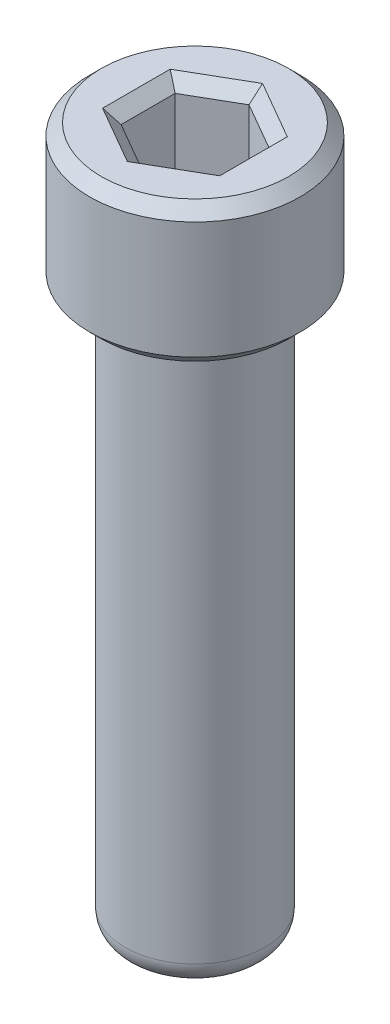
ISO-10303-21;
HEADER;
FILE_DESCRIPTION(('STEP AP214'),'2;1');
FILE_NAME('part.step','',(''),(''),'','','');
FILE_SCHEMA(('AUTOMOTIVE_DESIGN { 1 0 10303 214 1 1 1 1 }'));
ENDSEC;
DATA;
#1=APPLICATION_CONTEXT('core data for automotive mechanical design processes');
#2=APPLICATION_PROTOCOL_DEFINITION('international standard','automotive_design',2000,#1);
#3=PRODUCT_CONTEXT('',#1,'mechanical');
#4=PRODUCT('Part','Part','',(#3));
#5=PRODUCT_RELATED_PRODUCT_CATEGORY('part','',(#4));
#6=PRODUCT_DEFINITION_FORMATION('','',#4);
#7=PRODUCT_DEFINITION_CONTEXT('part definition',#1,'design');
#8=PRODUCT_DEFINITION('design','',#6,#7);
#9=PRODUCT_DEFINITION_SHAPE('','',#8);
#10=(LENGTH_UNIT() NAMED_UNIT(*) SI_UNIT(.MILLI.,.METRE.));
#11=(NAMED_UNIT(*) PLANE_ANGLE_UNIT() SI_UNIT($,.RADIAN.));
#12=(NAMED_UNIT(*) SI_UNIT($,.STERADIAN.) SOLID_ANGLE_UNIT());
#13=UNCERTAINTY_MEASURE_WITH_UNIT(LENGTH_MEASURE(1.E-05),#10,'distance_accuracy_value','');
#14=(GEOMETRIC_REPRESENTATION_CONTEXT(3) GLOBAL_UNCERTAINTY_ASSIGNED_CONTEXT((#13)) GLOBAL_UNIT_ASSIGNED_CONTEXT((#10,
#11,#12)) REPRESENTATION_CONTEXT('',''));
#15=CARTESIAN_POINT('',(0.,0.,0.));
#16=DIRECTION('',(0.,0.,1.));
#17=DIRECTION('',(1.,0.,0.));
#18=AXIS2_PLACEMENT_3D('',#15,#16,#17);
#19=CARTESIAN_POINT('',(0.,12.,0.));
#20=DIRECTION('',(0.,-1.,0.));
#21=DIRECTION('',(0.,0.,-1.));
#22=AXIS2_PLACEMENT_3D('',#19,#20,#21);
#23=CYLINDRICAL_SURFACE('',#22,1.5);
#24=CARTESIAN_POINT('',(0.,0.5,0.));
#25=DIRECTION('',(0.,1.,0.));
#26=DIRECTION('',(0.,0.,1.));
#27=AXIS2_PLACEMENT_3D('',#24,#25,#26);
#28=CIRCLE('',#27,1.5);
#29=CARTESIAN_POINT('',(0.,0.5,1.5));
#30=VERTEX_POINT('',#29);
#31=EDGE_CURVE('E58',#30,#30,#28,.T.);
#32=ORIENTED_EDGE('',*,*,#31,.T.);
#33=EDGE_LOOP('',(#32));
#34=FACE_BOUND('',#33,.T.);
#35=CARTESIAN_POINT('',(0.,12.,0.));
#36=DIRECTION('',(0.,1.,0.));
#37=DIRECTION('',(0.,0.,1.));
#38=AXIS2_PLACEMENT_3D('',#35,#36,#37);
#39=CIRCLE('',#38,1.5);
#40=CARTESIAN_POINT('',(0.,12.,1.5));
#41=VERTEX_POINT('',#40);
#42=EDGE_CURVE('E171',#41,#41,#39,.T.);
#43=ORIENTED_EDGE('',*,*,#42,.F.);
#44=EDGE_LOOP('',(#43));
#45=FACE_BOUND('',#44,.T.);
#46=ADVANCED_FACE('F49',(#34,#45),#23,.T.);
#47=CARTESIAN_POINT('',(0.,0.,0.));
#48=DIRECTION('',(0.,1.,0.));
#49=DIRECTION('',(0.,0.,1.));
#50=AXIS2_PLACEMENT_3D('',#47,#48,#49);
#51=PLANE('',#50);
#52=CARTESIAN_POINT('',(0.,0.,0.));
#53=DIRECTION('',(0.,1.,0.));
#54=DIRECTION('',(0.,0.,1.));
#55=AXIS2_PLACEMENT_3D('',#52,#53,#54);
#56=CIRCLE('',#55,1.);
#57=CARTESIAN_POINT('',(0.,0.,1.));
#58=VERTEX_POINT('',#57);
#59=EDGE_CURVE('E11',#58,#58,#56,.F.);
#60=ORIENTED_EDGE('',*,*,#59,.T.);
#61=EDGE_LOOP('',(#60));
#62=FACE_BOUND('',#61,.T.);
#63=ADVANCED_FACE('F272',(#62),#51,.F.);
#64=CARTESIAN_POINT('',(0.,15.,0.));
#65=DIRECTION('',(0.,-1.,0.));
#66=DIRECTION('',(0.,0.,-1.));
#67=AXIS2_PLACEMENT_3D('',#64,#65,#66);
#68=CYLINDRICAL_SURFACE('',#67,2.25);
#69=CARTESIAN_POINT('',(0.,12.25,0.));
#70=DIRECTION('',(0.,1.,0.));
#71=DIRECTION('',(0.,0.,1.));
#72=AXIS2_PLACEMENT_3D('',#69,#70,#71);
#73=CIRCLE('',#72,2.25);
#74=CARTESIAN_POINT('',(0.,12.25,2.25));
#75=VERTEX_POINT('',#74);
#76=EDGE_CURVE('E191',#75,#75,#73,.T.);
#77=ORIENTED_EDGE('',*,*,#76,.T.);
#78=EDGE_LOOP('',(#77));
#79=FACE_BOUND('',#78,.T.);
#80=CARTESIAN_POINT('',(0.,14.75,0.));
#81=DIRECTION('',(0.,1.,0.));
#82=DIRECTION('',(0.,0.,1.));
#83=AXIS2_PLACEMENT_3D('',#80,#81,#82);
#84=CIRCLE('',#83,2.25);
#85=CARTESIAN_POINT('',(0.,14.75,2.25));
#86=VERTEX_POINT('',#85);
#87=EDGE_CURVE('E187',#86,#86,#84,.F.);
#88=ORIENTED_EDGE('',*,*,#87,.T.);
#89=EDGE_LOOP('',(#88));
#90=FACE_BOUND('',#89,.T.);
#91=ADVANCED_FACE('F276',(#79,#90),#68,.T.);
#92=CARTESIAN_POINT('',(0.,15.,0.));
#93=DIRECTION('',(0.,1.,0.));
#94=DIRECTION('',(0.,0.,1.));
#95=AXIS2_PLACEMENT_3D('',#92,#93,#94);
#96=PLANE('',#95);
#97=CARTESIAN_POINT('',(0.,15.,0.));
#98=DIRECTION('',(0.,1.,0.));
#99=DIRECTION('',(0.,0.,1.));
#100=AXIS2_PLACEMENT_3D('',#97,#98,#99);
#101=CIRCLE('',#100,2.);
#102=CARTESIAN_POINT('',(0.,15.,2.));
#103=VERTEX_POINT('',#102);
#104=EDGE_CURVE('E218',#103,#103,#101,.T.);
#105=ORIENTED_EDGE('',*,*,#104,.T.);
#106=EDGE_LOOP('',(#105));
#107=FACE_BOUND('',#106,.T.);
#108=DIRECTION('',(-0.866025403784439,0.,0.5));
#109=VECTOR('',#108,1.);
#110=CARTESIAN_POINT('',(0.124999999999998,15.,1.37120688932536));
#111=LINE('',#110,#109);
#112=CARTESIAN_POINT('',(1.25,15.,0.721687836487031));
#113=VERTEX_POINT('',#112);
#114=CARTESIAN_POINT('',(0.,15.,1.44337567297406));
#115=VERTEX_POINT('',#114);
#116=EDGE_CURVE('E199',#113,#115,#111,.T.);
#117=ORIENTED_EDGE('',*,*,#116,.T.);
#118=DIRECTION('',(-0.866025403784439,0.,-0.5));
#119=VECTOR('',#118,1.);
#120=CARTESIAN_POINT('',(-1.125,15.,0.793856620135733));
#121=LINE('',#120,#119);
#122=CARTESIAN_POINT('',(-1.25,15.,0.72168783648703));
#123=VERTEX_POINT('',#122);
#124=EDGE_CURVE('E214',#115,#123,#121,.T.);
#125=ORIENTED_EDGE('',*,*,#124,.T.);
#126=DIRECTION('',(0.,0.,-1.));
#127=VECTOR('',#126,1.);
#128=CARTESIAN_POINT('',(-1.25,15.,-0.577350269189626));
#129=LINE('',#128,#127);
#130=CARTESIAN_POINT('',(-1.25,15.,-0.721687836487031));
#131=VERTEX_POINT('',#130);
#132=EDGE_CURVE('E211',#123,#131,#129,.T.);
#133=ORIENTED_EDGE('',*,*,#132,.T.);
#134=DIRECTION('',(0.866025403784439,0.,-0.5));
#135=VECTOR('',#134,1.);
#136=CARTESIAN_POINT('',(-0.124999999999999,15.,-1.37120688932536));
#137=LINE('',#136,#135);
#138=CARTESIAN_POINT('',(0.,15.,-1.44337567297406));
#139=VERTEX_POINT('',#138);
#140=EDGE_CURVE('E208',#131,#139,#137,.T.);
#141=ORIENTED_EDGE('',*,*,#140,.T.);
#142=DIRECTION('',(0.866025403784439,0.,0.5));
#143=VECTOR('',#142,1.);
#144=CARTESIAN_POINT('',(1.125,15.,-0.793856620135734));
#145=LINE('',#144,#143);
#146=CARTESIAN_POINT('',(1.25,15.,-0.721687836487032));
#147=VERTEX_POINT('',#146);
#148=EDGE_CURVE('E205',#139,#147,#145,.T.);
#149=ORIENTED_EDGE('',*,*,#148,.T.);
#150=DIRECTION('',(0.,0.,1.));
#151=VECTOR('',#150,1.);
#152=CARTESIAN_POINT('',(1.25,15.,0.577350269189625));
#153=LINE('',#152,#151);
#154=EDGE_CURVE('E202',#147,#113,#153,.T.);
#155=ORIENTED_EDGE('',*,*,#154,.T.);
#156=EDGE_LOOP('',(#117,#125,#133,#141,#149,#155));
#157=FACE_BOUND('',#156,.T.);
#158=ADVANCED_FACE('F338',(#107,#157),#96,.T.);
#159=CARTESIAN_POINT('',(0.,12.,0.));
#160=DIRECTION('',(0.,1.,0.));
#161=DIRECTION('',(0.,0.,1.));
#162=AXIS2_PLACEMENT_3D('',#159,#160,#161);
#163=PLANE('',#162);
#164=CARTESIAN_POINT('',(0.,12.,0.));
#165=DIRECTION('',(0.,1.,0.));
#166=DIRECTION('',(0.,0.,1.));
#167=AXIS2_PLACEMENT_3D('',#164,#165,#166);
#168=CIRCLE('',#167,1.99999999999999);
#169=CARTESIAN_POINT('',(0.,12.,1.99999999999999));
#170=VERTEX_POINT('',#169);
#171=EDGE_CURVE('E195',#170,#170,#168,.F.);
#172=ORIENTED_EDGE('',*,*,#171,.T.);
#173=EDGE_LOOP('',(#172));
#174=FACE_BOUND('',#173,.T.);
#175=ORIENTED_EDGE('',*,*,#42,.T.);
#176=EDGE_LOOP('',(#175));
#177=FACE_BOUND('',#176,.T.);
#178=ADVANCED_FACE('F372',(#174,#177),#163,.F.);
#179=CARTESIAN_POINT('',(1.,13.,-0.577350269189627));
#180=DIRECTION('',(0.5,0.,-0.866025403784439));
#181=DIRECTION('',(-0.866025403784439,0.,-0.5));
#182=AXIS2_PLACEMENT_3D('',#179,#180,#181);
#183=PLANE('',#182);
#184=DIRECTION('',(0.,1.,0.));
#185=VECTOR('',#184,1.);
#186=CARTESIAN_POINT('',(1.,13.,-0.577350269189627));
#187=LINE('',#186,#185);
#188=CARTESIAN_POINT('',(1.,13.,-0.577350269189627));
#189=VERTEX_POINT('',#188);
#190=CARTESIAN_POINT('',(1.,14.75,-0.577350269189627));
#191=VERTEX_POINT('',#190);
#192=EDGE_CURVE('E168',#189,#191,#187,.T.);
#193=ORIENTED_EDGE('',*,*,#192,.T.);
#194=DIRECTION('',(-0.866025403784439,0.,-0.5));
#195=VECTOR('',#194,1.);
#196=CARTESIAN_POINT('',(0.,14.75,-1.15470053837925));
#197=LINE('',#196,#195);
#198=CARTESIAN_POINT('',(0.,14.75,-1.15470053837925));
#199=VERTEX_POINT('',#198);
#200=EDGE_CURVE('E129',#191,#199,#197,.T.);
#201=ORIENTED_EDGE('',*,*,#200,.T.);
#202=DIRECTION('',(0.,1.,0.));
#203=VECTOR('',#202,1.);
#204=CARTESIAN_POINT('',(0.,13.,-1.15470053837925));
#205=LINE('',#204,#203);
#206=CARTESIAN_POINT('',(0.,13.,-1.15470053837925));
#207=VERTEX_POINT('',#206);
#208=EDGE_CURVE('E122',#207,#199,#205,.T.);
#209=ORIENTED_EDGE('',*,*,#208,.F.);
#210=DIRECTION('',(-0.866025403784439,0.,-0.5));
#211=VECTOR('',#210,1.);
#212=CARTESIAN_POINT('',(1.,13.,-0.577350269189627));
#213=LINE('',#212,#211);
#214=EDGE_CURVE('E126',#189,#207,#213,.T.);
#215=ORIENTED_EDGE('',*,*,#214,.F.);
#216=EDGE_LOOP('',(#193,#201,#209,#215));
#217=FACE_BOUND('',#216,.T.);
#218=ADVANCED_FACE('F124',(#217),#183,.F.);
#219=CARTESIAN_POINT('',(1.,13.,0.577350269189625));
#220=DIRECTION('',(1.,0.,0.));
#221=DIRECTION('',(0.,0.,-1.));
#222=AXIS2_PLACEMENT_3D('',#219,#220,#221);
#223=PLANE('',#222);
#224=DIRECTION('',(0.,1.,0.));
#225=VECTOR('',#224,1.);
#226=CARTESIAN_POINT('',(1.,13.,0.577350269189625));
#227=LINE('',#226,#225);
#228=CARTESIAN_POINT('',(1.,13.,0.577350269189625));
#229=VERTEX_POINT('',#228);
#230=CARTESIAN_POINT('',(1.,14.75,0.577350269189625));
#231=VERTEX_POINT('',#230);
#232=EDGE_CURVE('E172',#229,#231,#227,.T.);
#233=ORIENTED_EDGE('',*,*,#232,.T.);
#234=DIRECTION('',(0.,0.,-1.));
#235=VECTOR('',#234,1.);
#236=CARTESIAN_POINT('',(1.,14.75,-0.577350269189627));
#237=LINE('',#236,#235);
#238=EDGE_CURVE('E72',#231,#191,#237,.T.);
#239=ORIENTED_EDGE('',*,*,#238,.T.);
#240=ORIENTED_EDGE('',*,*,#192,.F.);
#241=DIRECTION('',(0.,0.,-1.));
#242=VECTOR('',#241,1.);
#243=CARTESIAN_POINT('',(1.,13.,0.577350269189625));
#244=LINE('',#243,#242);
#245=EDGE_CURVE('E134',#229,#189,#244,.T.);
#246=ORIENTED_EDGE('',*,*,#245,.F.);
#247=EDGE_LOOP('',(#233,#239,#240,#246));
#248=FACE_BOUND('',#247,.T.);
#249=ADVANCED_FACE('F353',(#248),#223,.F.);
#250=CARTESIAN_POINT('',(0.,13.,1.15470053837925));
#251=DIRECTION('',(0.5,0.,0.866025403784439));
#252=DIRECTION('',(0.866025403784439,0.,-0.5));
#253=AXIS2_PLACEMENT_3D('',#250,#251,#252);
#254=PLANE('',#253);
#255=DIRECTION('',(0.,1.,0.));
#256=VECTOR('',#255,1.);
#257=CARTESIAN_POINT('',(0.,13.,1.15470053837925));
#258=LINE('',#257,#256);
#259=CARTESIAN_POINT('',(0.,13.,1.15470053837925));
#260=VERTEX_POINT('',#259);
#261=CARTESIAN_POINT('',(0.,14.75,1.15470053837925));
#262=VERTEX_POINT('',#261);
#263=EDGE_CURVE('E175',#260,#262,#258,.T.);
#264=ORIENTED_EDGE('',*,*,#263,.T.);
#265=DIRECTION('',(0.866025403784439,0.,-0.5));
#266=VECTOR('',#265,1.);
#267=CARTESIAN_POINT('',(1.,14.75,0.577350269189625));
#268=LINE('',#267,#266);
#269=EDGE_CURVE('E65',#262,#231,#268,.T.);
#270=ORIENTED_EDGE('',*,*,#269,.T.);
#271=ORIENTED_EDGE('',*,*,#232,.F.);
#272=DIRECTION('',(0.866025403784439,0.,-0.5));
#273=VECTOR('',#272,1.);
#274=CARTESIAN_POINT('',(0.,13.,1.15470053837925));
#275=LINE('',#274,#273);
#276=EDGE_CURVE('E163',#260,#229,#275,.T.);
#277=ORIENTED_EDGE('',*,*,#276,.F.);
#278=EDGE_LOOP('',(#264,#270,#271,#277));
#279=FACE_BOUND('',#278,.T.);
#280=ADVANCED_FACE('F355',(#279),#254,.F.);
#281=CARTESIAN_POINT('',(-1.,13.,0.577350269189626));
#282=DIRECTION('',(-0.5,0.,0.866025403784439));
#283=DIRECTION('',(0.866025403784439,0.,0.5));
#284=AXIS2_PLACEMENT_3D('',#281,#282,#283);
#285=PLANE('',#284);
#286=DIRECTION('',(0.,1.,0.));
#287=VECTOR('',#286,1.);
#288=CARTESIAN_POINT('',(-1.,13.,0.577350269189626));
#289=LINE('',#288,#287);
#290=CARTESIAN_POINT('',(-1.,13.,0.577350269189626));
#291=VERTEX_POINT('',#290);
#292=CARTESIAN_POINT('',(-1.,14.75,0.577350269189626));
#293=VERTEX_POINT('',#292);
#294=EDGE_CURVE('E178',#291,#293,#289,.T.);
#295=ORIENTED_EDGE('',*,*,#294,.T.);
#296=DIRECTION('',(0.866025403784439,0.,0.5));
#297=VECTOR('',#296,1.);
#298=CARTESIAN_POINT('',(0.,14.75,1.15470053837925));
#299=LINE('',#298,#297);
#300=EDGE_CURVE('E222',#293,#262,#299,.T.);
#301=ORIENTED_EDGE('',*,*,#300,.T.);
#302=ORIENTED_EDGE('',*,*,#263,.F.);
#303=DIRECTION('',(0.866025403784439,0.,0.5));
#304=VECTOR('',#303,1.);
#305=CARTESIAN_POINT('',(-1.,13.,0.577350269189626));
#306=LINE('',#305,#304);
#307=EDGE_CURVE('E159',#291,#260,#306,.T.);
#308=ORIENTED_EDGE('',*,*,#307,.F.);
#309=EDGE_LOOP('',(#295,#301,#302,#308));
#310=FACE_BOUND('',#309,.T.);
#311=ADVANCED_FACE('F351',(#310),#285,.F.);
#312=CARTESIAN_POINT('',(-1.,13.,-0.577350269189626));
#313=DIRECTION('',(-1.,0.,0.));
#314=DIRECTION('',(0.,0.,1.));
#315=AXIS2_PLACEMENT_3D('',#312,#313,#314);
#316=PLANE('',#315);
#317=DIRECTION('',(0.,1.,0.));
#318=VECTOR('',#317,1.);
#319=CARTESIAN_POINT('',(-1.,13.,-0.577350269189626));
#320=LINE('',#319,#318);
#321=CARTESIAN_POINT('',(-1.,13.,-0.577350269189626));
#322=VERTEX_POINT('',#321);
#323=CARTESIAN_POINT('',(-1.,14.75,-0.577350269189626));
#324=VERTEX_POINT('',#323);
#325=EDGE_CURVE('E133',#322,#324,#320,.T.);
#326=ORIENTED_EDGE('',*,*,#325,.T.);
#327=DIRECTION('',(0.,0.,1.));
#328=VECTOR('',#327,1.);
#329=CARTESIAN_POINT('',(-1.,14.75,0.577350269189626));
#330=LINE('',#329,#328);
#331=EDGE_CURVE('E226',#324,#293,#330,.T.);
#332=ORIENTED_EDGE('',*,*,#331,.T.);
#333=ORIENTED_EDGE('',*,*,#294,.F.);
#334=DIRECTION('',(0.,0.,1.));
#335=VECTOR('',#334,1.);
#336=CARTESIAN_POINT('',(-1.,13.,-0.577350269189626));
#337=LINE('',#336,#335);
#338=EDGE_CURVE('E144',#322,#291,#337,.T.);
#339=ORIENTED_EDGE('',*,*,#338,.F.);
#340=EDGE_LOOP('',(#326,#332,#333,#339));
#341=FACE_BOUND('',#340,.T.);
#342=ADVANCED_FACE('F348',(#341),#316,.F.);
#343=CARTESIAN_POINT('',(0.,13.,-1.15470053837925));
#344=DIRECTION('',(-0.5,0.,-0.866025403784439));
#345=DIRECTION('',(-0.866025403784439,0.,0.5));
#346=AXIS2_PLACEMENT_3D('',#343,#344,#345);
#347=PLANE('',#346);
#348=ORIENTED_EDGE('',*,*,#208,.T.);
#349=DIRECTION('',(-0.866025403784439,0.,0.5));
#350=VECTOR('',#349,1.);
#351=CARTESIAN_POINT('',(-1.,14.75,-0.577350269189626));
#352=LINE('',#351,#350);
#353=EDGE_CURVE('E229',#199,#324,#352,.T.);
#354=ORIENTED_EDGE('',*,*,#353,.T.);
#355=ORIENTED_EDGE('',*,*,#325,.F.);
#356=DIRECTION('',(-0.866025403784439,0.,0.5));
#357=VECTOR('',#356,1.);
#358=CARTESIAN_POINT('',(0.,13.,-1.15470053837925));
#359=LINE('',#358,#357);
#360=EDGE_CURVE('E137',#207,#322,#359,.T.);
#361=ORIENTED_EDGE('',*,*,#360,.F.);
#362=EDGE_LOOP('',(#348,#354,#355,#361));
#363=FACE_BOUND('',#362,.T.);
#364=ADVANCED_FACE('F138',(#363),#347,.F.);
#365=CARTESIAN_POINT('',(0.,13.,0.));
#366=DIRECTION('',(0.,1.,0.));
#367=DIRECTION('',(0.,0.,1.));
#368=AXIS2_PLACEMENT_3D('',#365,#366,#367);
#369=PLANE('',#368);
#370=ORIENTED_EDGE('',*,*,#214,.T.);
#371=ORIENTED_EDGE('',*,*,#360,.T.);
#372=ORIENTED_EDGE('',*,*,#338,.T.);
#373=ORIENTED_EDGE('',*,*,#307,.T.);
#374=ORIENTED_EDGE('',*,*,#276,.T.);
#375=ORIENTED_EDGE('',*,*,#245,.T.);
#376=EDGE_LOOP('',(#370,#371,#372,#373,#374,#375));
#377=FACE_BOUND('',#376,.T.);
#378=ADVANCED_FACE('F146',(#377),#369,.T.);
#379=CARTESIAN_POINT('',(0.,12.25,0.));
#380=DIRECTION('',(0.,1.,0.));
#381=DIRECTION('',(0.,0.,1.));
#382=AXIS2_PLACEMENT_3D('',#379,#380,#381);
#383=CONICAL_SURFACE('',#382,2.25,0.785398163397454);
#384=ORIENTED_EDGE('',*,*,#171,.F.);
#385=EDGE_LOOP('',(#384));
#386=FACE_BOUND('',#385,.T.);
#387=ORIENTED_EDGE('',*,*,#76,.F.);
#388=EDGE_LOOP('',(#387));
#389=FACE_BOUND('',#388,.T.);
#390=ADVANCED_FACE('F282',(#386,#389),#383,.T.);
#391=CARTESIAN_POINT('',(0.,15.,0.));
#392=DIRECTION('',(0.,-1.,0.));
#393=DIRECTION('',(0.,0.,-1.));
#394=AXIS2_PLACEMENT_3D('',#391,#392,#393);
#395=CONICAL_SURFACE('',#394,2.,0.785398163397451);
#396=ORIENTED_EDGE('',*,*,#87,.F.);
#397=EDGE_LOOP('',(#396));
#398=FACE_BOUND('',#397,.T.);
#399=ORIENTED_EDGE('',*,*,#104,.F.);
#400=EDGE_LOOP('',(#399));
#401=FACE_BOUND('',#400,.T.);
#402=ADVANCED_FACE('F288',(#398,#401),#395,.T.);
#403=CARTESIAN_POINT('',(1.,14.75,-0.577350269189627));
#404=DIRECTION('',(-0.353553390593272,0.707106781186551,0.612372435695792));
#405=DIRECTION('',(0.866025403784439,0.,0.5));
#406=AXIS2_PLACEMENT_3D('',#403,#404,#405);
#407=PLANE('',#406);
#408=DIRECTION('',(-0.65465367070798,-0.654653670707974,0.377964473009229));
#409=VECTOR('',#408,1.);
#410=CARTESIAN_POINT('',(1.,14.75,-0.577350269189627));
#411=LINE('',#410,#409);
#412=EDGE_CURVE('E154',#147,#191,#411,.T.);
#413=ORIENTED_EDGE('',*,*,#412,.F.);
#414=ORIENTED_EDGE('',*,*,#148,.F.);
#415=DIRECTION('',(0.,-0.654653670707973,0.755928946018458));
#416=VECTOR('',#415,1.);
#417=CARTESIAN_POINT('',(0.,14.75,-1.15470053837925));
#418=LINE('',#417,#416);
#419=EDGE_CURVE('E150',#199,#139,#418,.F.);
#420=ORIENTED_EDGE('',*,*,#419,.F.);
#421=ORIENTED_EDGE('',*,*,#200,.F.);
#422=EDGE_LOOP('',(#413,#414,#420,#421));
#423=FACE_BOUND('',#422,.T.);
#424=ADVANCED_FACE('F294',(#423),#407,.T.);
#425=CARTESIAN_POINT('',(0.,14.75,-1.15470053837925));
#426=DIRECTION('',(0.353553390593272,0.707106781186551,0.612372435695791));
#427=DIRECTION('',(0.866025403784439,0.,-0.5));
#428=AXIS2_PLACEMENT_3D('',#425,#426,#427);
#429=PLANE('',#428);
#430=ORIENTED_EDGE('',*,*,#419,.T.);
#431=ORIENTED_EDGE('',*,*,#140,.F.);
#432=DIRECTION('',(0.65465367070798,-0.654653670707973,0.377964473009229));
#433=VECTOR('',#432,1.);
#434=CARTESIAN_POINT('',(-1.,14.75,-0.577350269189626));
#435=LINE('',#434,#433);
#436=EDGE_CURVE('E248',#324,#131,#435,.F.);
#437=ORIENTED_EDGE('',*,*,#436,.F.);
#438=ORIENTED_EDGE('',*,*,#353,.F.);
#439=EDGE_LOOP('',(#430,#431,#437,#438));
#440=FACE_BOUND('',#439,.T.);
#441=ADVANCED_FACE('F320',(#440),#429,.T.);
#442=CARTESIAN_POINT('',(1.,14.75,0.577350269189625));
#443=DIRECTION('',(-0.707106781186544,0.707106781186551,0.));
#444=DIRECTION('',(0.,0.,1.));
#445=AXIS2_PLACEMENT_3D('',#442,#443,#444);
#446=PLANE('',#445);
#447=ORIENTED_EDGE('',*,*,#412,.T.);
#448=ORIENTED_EDGE('',*,*,#238,.F.);
#449=DIRECTION('',(-0.65465367070798,-0.654653670707973,-0.377964473009229));
#450=VECTOR('',#449,1.);
#451=CARTESIAN_POINT('',(1.,14.75,0.577350269189625));
#452=LINE('',#451,#450);
#453=EDGE_CURVE('E244',#113,#231,#452,.T.);
#454=ORIENTED_EDGE('',*,*,#453,.F.);
#455=ORIENTED_EDGE('',*,*,#154,.F.);
#456=EDGE_LOOP('',(#447,#448,#454,#455));
#457=FACE_BOUND('',#456,.T.);
#458=ADVANCED_FACE('F313',(#457),#446,.T.);
#459=CARTESIAN_POINT('',(-1.,14.75,-0.577350269189626));
#460=DIRECTION('',(0.707106781186544,0.707106781186551,0.));
#461=DIRECTION('',(0.,0.,-1.));
#462=AXIS2_PLACEMENT_3D('',#459,#460,#461);
#463=PLANE('',#462);
#464=ORIENTED_EDGE('',*,*,#436,.T.);
#465=ORIENTED_EDGE('',*,*,#132,.F.);
#466=DIRECTION('',(0.65465367070798,-0.654653670707974,-0.377964473009228));
#467=VECTOR('',#466,1.);
#468=CARTESIAN_POINT('',(-1.,14.75,0.577350269189626));
#469=LINE('',#468,#467);
#470=EDGE_CURVE('E241',#293,#123,#469,.F.);
#471=ORIENTED_EDGE('',*,*,#470,.F.);
#472=ORIENTED_EDGE('',*,*,#331,.F.);
#473=EDGE_LOOP('',(#464,#465,#471,#472));
#474=FACE_BOUND('',#473,.T.);
#475=ADVANCED_FACE('F306',(#474),#463,.T.);
#476=CARTESIAN_POINT('',(0.,14.75,1.15470053837925));
#477=DIRECTION('',(-0.353553390593272,0.707106781186551,-0.612372435695791));
#478=DIRECTION('',(-0.866025403784439,0.,0.5));
#479=AXIS2_PLACEMENT_3D('',#476,#477,#478);
#480=PLANE('',#479);
#481=ORIENTED_EDGE('',*,*,#453,.T.);
#482=ORIENTED_EDGE('',*,*,#269,.F.);
#483=DIRECTION('',(0.,0.654653670707974,0.755928946018458));
#484=VECTOR('',#483,1.);
#485=CARTESIAN_POINT('',(0.,14.4642857142857,0.824786098842319));
#486=LINE('',#485,#484);
#487=EDGE_CURVE('E238',#115,#262,#486,.F.);
#488=ORIENTED_EDGE('',*,*,#487,.F.);
#489=ORIENTED_EDGE('',*,*,#116,.F.);
#490=EDGE_LOOP('',(#481,#482,#488,#489));
#491=FACE_BOUND('',#490,.T.);
#492=ADVANCED_FACE('F267',(#491),#480,.T.);
#493=CARTESIAN_POINT('',(-1.,14.75,0.577350269189626));
#494=DIRECTION('',(0.353553390593272,0.70710678118655,-0.612372435695792));
#495=DIRECTION('',(-0.866025403784439,0.,-0.5));
#496=AXIS2_PLACEMENT_3D('',#493,#494,#495);
#497=PLANE('',#496);
#498=ORIENTED_EDGE('',*,*,#470,.T.);
#499=ORIENTED_EDGE('',*,*,#124,.F.);
#500=ORIENTED_EDGE('',*,*,#487,.T.);
#501=ORIENTED_EDGE('',*,*,#300,.F.);
#502=EDGE_LOOP('',(#498,#499,#500,#501));
#503=FACE_BOUND('',#502,.T.);
#504=ADVANCED_FACE('F261',(#503),#497,.T.);
#505=CARTESIAN_POINT('',(0.,0.5,0.));
#506=DIRECTION('',(0.,1.,0.));
#507=DIRECTION('',(0.,0.,1.));
#508=AXIS2_PLACEMENT_3D('',#505,#506,#507);
#509=TOROIDAL_SURFACE('',#508,1.,0.5);
#510=ORIENTED_EDGE('',*,*,#59,.F.);
#511=EDGE_LOOP('',(#510));
#512=FACE_BOUND('',#511,.T.);
#513=ORIENTED_EDGE('',*,*,#31,.F.);
#514=EDGE_LOOP('',(#513));
#515=FACE_BOUND('',#514,.T.);
#516=ADVANCED_FACE('F51',(#512,#515),#509,.T.);
#517=CLOSED_SHELL('',(#46,#63,#91,#158,#178,#218,#249,#280,#311,#342,#364,#378,#390,#402,#424,
#441,#458,#475,#492,#504,#516));
#518=MANIFOLD_SOLID_BREP('B2',#517);
#519=ADVANCED_BREP_SHAPE_REPRESENTATION('',(#18,#518),#14);
#520=SHAPE_DEFINITION_REPRESENTATION(#9,#519);
ENDSEC;
END-ISO-10303-21;
